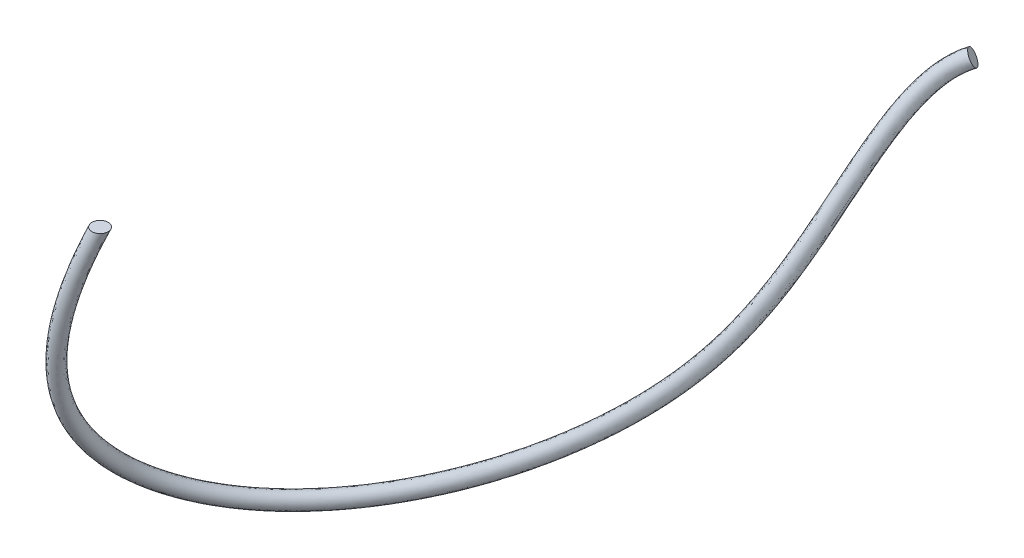
ISO-10303-21;
HEADER;
FILE_DESCRIPTION(('STEP AP214'),'2;1');
FILE_NAME('part.step','',(''),(''),'','','');
FILE_SCHEMA(('AUTOMOTIVE_DESIGN { 1 0 10303 214 1 1 1 1 }'));
ENDSEC;
DATA;
#1=APPLICATION_CONTEXT('core data for automotive mechanical design processes');
#2=APPLICATION_PROTOCOL_DEFINITION('international standard','automotive_design',2000,#1);
#3=PRODUCT_CONTEXT('',#1,'mechanical');
#4=PRODUCT('Part','Part','',(#3));
#5=PRODUCT_RELATED_PRODUCT_CATEGORY('part','',(#4));
#6=PRODUCT_DEFINITION_FORMATION('','',#4);
#7=PRODUCT_DEFINITION_CONTEXT('part definition',#1,'design');
#8=PRODUCT_DEFINITION('design','',#6,#7);
#9=PRODUCT_DEFINITION_SHAPE('','',#8);
#10=(LENGTH_UNIT() NAMED_UNIT(*) SI_UNIT(.MILLI.,.METRE.));
#11=(NAMED_UNIT(*) PLANE_ANGLE_UNIT() SI_UNIT($,.RADIAN.));
#12=(NAMED_UNIT(*) SI_UNIT($,.STERADIAN.) SOLID_ANGLE_UNIT());
#13=UNCERTAINTY_MEASURE_WITH_UNIT(LENGTH_MEASURE(1.E-05),#10,'distance_accuracy_value','');
#14=(GEOMETRIC_REPRESENTATION_CONTEXT(3) GLOBAL_UNCERTAINTY_ASSIGNED_CONTEXT((#13)) GLOBAL_UNIT_ASSIGNED_CONTEXT((#10,
#11,#12)) REPRESENTATION_CONTEXT('',''));
#15=CARTESIAN_POINT('',(0.,0.,0.));
#16=DIRECTION('',(0.,0.,1.));
#17=DIRECTION('',(1.,0.,0.));
#18=AXIS2_PLACEMENT_3D('',#15,#16,#17);
#19=CARTESIAN_POINT('',(0.,0.,0.));
#20=DIRECTION('',(0.,1.,0.));
#21=DIRECTION('',(0.,0.,1.));
#22=AXIS2_PLACEMENT_3D('',#19,#20,#21);
#23=PLANE('',#22);
#24=CARTESIAN_POINT('',(0.,0.,0.));
#25=DIRECTION('',(0.,1.,0.));
#26=DIRECTION('',(0.,0.,1.));
#27=AXIS2_PLACEMENT_3D('',#24,#25,#26);
#28=CIRCLE('',#27,7.5);
#29=CARTESIAN_POINT('',(0.,0.,7.5));
#30=VERTEX_POINT('',#29);
#31=EDGE_CURVE('E43',#30,#30,#28,.T.);
#32=ORIENTED_EDGE('',*,*,#31,.T.);
#33=EDGE_LOOP('',(#32));
#34=FACE_BOUND('',#33,.T.);
#35=ADVANCED_FACE('F40',(#34),#23,.T.);
#36=CARTESIAN_POINT('',(16.3575733903024,-250.728660027312,-788.848964241957));
#37=DIRECTION('',(-0.683695568227497,-0.446167800164738,0.57748996881525));
#38=DIRECTION('',(0.368721117797001,-0.894094457443813,-0.254243659623573));
#39=AXIS2_PLACEMENT_3D('',#36,#37,#38);
#40=PLANE('',#39);
#41=CARTESIAN_POINT('',(16.3575733903024,-250.728660027312,-788.848964241957));
#42=DIRECTION('',(-0.683695568227497,-0.446167800164738,0.57748996881525));
#43=DIRECTION('',(0.368721117797001,-0.894094457443813,-0.254243659623573));
#44=AXIS2_PLACEMENT_3D('',#41,#42,#43);
#45=CIRCLE('',#44,7.5);
#46=CARTESIAN_POINT('',(19.1229817737799,-257.43436845814,-790.755791689134));
#47=VERTEX_POINT('',#46);
#48=EDGE_CURVE('E10',#47,#47,#45,.T.);
#49=ORIENTED_EDGE('',*,*,#48,.F.);
#50=EDGE_LOOP('',(#49));
#51=FACE_BOUND('',#50,.T.);
#52=ADVANCED_FACE('F55',(#51),#40,.F.);
#53=CARTESIAN_POINT('',(0.,0.,7.5));
#54=CARTESIAN_POINT('',(-11.1618015849688,-32.0464705937914,16.0382003137222));
#55=CARTESIAN_POINT('',(-18.9478800948642,-60.5336568146009,20.0959737990293));
#56=CARTESIAN_POINT('',(-28.7630584166155,-111.260305422799,20.8725575819973));
#57=CARTESIAN_POINT('',(-30.7840470941697,-133.506888766767,17.5770635508047));
#58=CARTESIAN_POINT('',(-30.0401473990787,-172.30874768067,5.32295182935118));
#59=CARTESIAN_POINT('',(-27.2712051975191,-188.83273129367,-3.63054355530714));
#60=CARTESIAN_POINT('',(-18.2122338493691,-216.71564633669,-25.0994943581514));
#61=CARTESIAN_POINT('',(-11.9356352982529,-228.086848738524,-37.595818897333));
#62=CARTESIAN_POINT('',(-3.77736511397498,-238.396408369888,-52.3207695902847));
#63=CARTESIAN_POINT('',(-2.95915738033024,-239.358881332589,-53.7391039221649));
#64=CARTESIAN_POINT('',(-1.30242075018415,-241.239735220192,-56.5963553647243));
#65=CARTESIAN_POINT('',(-0.461518318297899,-242.157484029244,-58.0345049509065));
#66=CARTESIAN_POINT('',(2.09650771401458,-244.844227542704,-62.377240756336));
#67=CARTESIAN_POINT('',(3.84894917965659,-246.546714919568,-65.3101037685399));
#68=CARTESIAN_POINT('',(9.22957133003836,-251.400532502516,-74.2198135574643));
#69=CARTESIAN_POINT('',(12.9809682465942,-254.29823108983,-80.307684568391));
#70=CARTESIAN_POINT('',(24.5882343827688,-262.076320361142,-99.0034181225339));
#71=CARTESIAN_POINT('',(32.7965840400826,-266.042603698179,-112.043022664963));
#72=CARTESIAN_POINT('',(57.754126315555,-275.059825369128,-152.826632290379));
#73=CARTESIAN_POINT('',(74.8392986511099,-277.234937698086,-182.241158176726));
#74=CARTESIAN_POINT('',(104.241554883184,-277.814461691158,-245.201506912081));
#75=CARTESIAN_POINT('',(116.556841647994,-276.213552765347,-278.748784839952));
#76=CARTESIAN_POINT('',(127.185318850889,-273.825491693411,-331.826074783329));
#77=CARTESIAN_POINT('',(129.42076874177,-273.031412866059,-349.976469841928));
#78=CARTESIAN_POINT('',(130.576100882561,-271.916905031733,-387.12599135088));
#79=CARTESIAN_POINT('',(129.496097907829,-271.596508491265,-406.124625117153));
#80=CARTESIAN_POINT('',(122.623804864741,-271.927540678041,-449.363148233423));
#81=CARTESIAN_POINT('',(115.849064978897,-272.790158137765,-473.858944521846));
#82=CARTESIAN_POINT('',(99.0647375656334,-274.462809107408,-523.1251622497));
#83=CARTESIAN_POINT('',(89.0549722080328,-275.273202600413,-547.894089485221));
#84=CARTESIAN_POINT('',(68.8042929253061,-275.408584739741,-596.084480691814));
#85=CARTESIAN_POINT('',(58.5959772366743,-274.788941294156,-619.458398305459));
#86=CARTESIAN_POINT('',(39.9415068970359,-272.617424425601,-663.938580474761));
#87=CARTESIAN_POINT('',(31.4941364265422,-271.065307356145,-685.045894464));
#88=CARTESIAN_POINT('',(21.8030401643602,-268.368155355462,-713.917944906596));
#89=CARTESIAN_POINT('',(19.0697430825142,-267.407597624893,-723.076920350656));
#90=CARTESIAN_POINT('',(14.8819531175496,-265.419847094218,-740.27157195256));
#91=CARTESIAN_POINT('',(13.4277360549122,-264.392481637056,-748.30806614192));
#92=CARTESIAN_POINT('',(12.0879060547827,-262.331326948363,-763.040733837649));
#93=CARTESIAN_POINT('',(12.2052940273813,-261.297170307341,-769.73747903352));
#94=CARTESIAN_POINT('',(13.752168777139,-259.795459856179,-778.574843840509));
#95=CARTESIAN_POINT('',(14.4956838585473,-259.303331432565,-781.318572620361));
#96=CARTESIAN_POINT('',(16.4547186527017,-258.346255176376,-786.369208180903));
#97=CARTESIAN_POINT('',(17.6699131604589,-257.881449967253,-788.675467786732));
#98=CARTESIAN_POINT('',(19.1229817737799,-257.43436845814,-790.755791689134));
#99=CARTESIAN_POINT('',(15.,0.,7.5));
#100=CARTESIAN_POINT('',(3.83819841506113,-31.4719986749403,16.283221238473));
#101=CARTESIAN_POINT('',(-3.98348081546146,-59.2776055946513,20.6751286567963));
#102=CARTESIAN_POINT('',(-14.0774430845927,-108.505481033694,22.4818977301512));
#103=CARTESIAN_POINT('',(-16.3536869416441,-129.932909790625,19.9012060281644));
#104=CARTESIAN_POINT('',(-16.4223975532795,-167.411695931407,9.44436316614331));
#105=CARTESIAN_POINT('',(-14.2077073977538,-183.466422951943,1.55634067101938));
#106=CARTESIAN_POINT('',(-6.28292603161599,-211.036397708549,-17.9027063266077));
#107=CARTESIAN_POINT('',(-0.569937700859168,-222.53716187297,-29.4700778889347));
#108=CARTESIAN_POINT('',(7.0476825167024,-233.237930185374,-43.3085650515837));
#109=CARTESIAN_POINT('',(7.818050374449,-234.203750022783,-44.6681445619783));
#110=CARTESIAN_POINT('',(9.38101252929492,-236.102358306089,-47.4051910570711));
#111=CARTESIAN_POINT('',(10.1763781665679,-237.030514771748,-48.7849297164958));
#112=CARTESIAN_POINT('',(12.602082801414,-239.752601529689,-52.9576109198873));
#113=CARTESIAN_POINT('',(14.2720447687662,-241.484128712918,-55.7840285042406));
#114=CARTESIAN_POINT('',(19.423743961582,-246.437733261321,-64.3955216820766));
#115=CARTESIAN_POINT('',(23.0473873111753,-249.418670898604,-70.3128696414143));
#116=CARTESIAN_POINT('',(34.3487026401856,-257.470069596083,-88.5788022177583));
#117=CARTESIAN_POINT('',(42.4567771989537,-261.647627332644,-101.440596145388));
#118=CARTESIAN_POINT('',(67.3818813622576,-271.256374483098,-141.962632888555));
#119=CARTESIAN_POINT('',(84.7976596463846,-273.761591514803,-171.548600787601));
#120=CARTESIAN_POINT('',(115.272347809912,-274.711823203372,-235.492793673024));
#121=CARTESIAN_POINT('',(128.344934903229,-273.157475760103,-269.86806980089));
#122=CARTESIAN_POINT('',(140.101514385526,-270.676462534691,-324.840591944771));
#123=CARTESIAN_POINT('',(142.70786202187,-269.825696643224,-343.732468224646));
#124=CARTESIAN_POINT('',(144.498029827597,-268.575970784958,-382.562103387822));
#125=CARTESIAN_POINT('',(143.679849566361,-268.177565413607,-402.499739885691));
#126=CARTESIAN_POINT('',(137.175003762596,-268.354920456154,-447.940873668208));
#127=CARTESIAN_POINT('',(130.41523591804,-269.212059625179,-473.272659199804));
#128=CARTESIAN_POINT('',(113.64282033327,-270.926788808174,-523.669146198242));
#129=CARTESIAN_POINT('',(103.620278727544,-271.787096706797,-548.739269022935));
#130=CARTESIAN_POINT('',(83.3991192400739,-272.095990289879,-597.100573753718));
#131=CARTESIAN_POINT('',(73.2099789728912,-271.547657367645,-620.441190287453));
#132=CARTESIAN_POINT('',(54.6092884575632,-269.53190669043,-664.552268275368));
#133=CARTESIAN_POINT('',(46.2017089878359,-268.061793201332,-685.332890307513));
#134=CARTESIAN_POINT('',(36.5245462509587,-265.549963603695,-713.255304409086));
#135=CARTESIAN_POINT('',(33.7880984563526,-264.661910157035,-722.018599784729));
#136=CARTESIAN_POINT('',(29.5205693911793,-262.863745887792,-738.158260045614));
#137=CARTESIAN_POINT('',(27.9948527061985,-261.953047097885,-745.535428674984));
#138=CARTESIAN_POINT('',(26.2589411065192,-260.214619784816,-758.508564019051));
#139=CARTESIAN_POINT('',(26.0605709578844,-259.38845513115,-764.089634931135));
#140=CARTESIAN_POINT('',(26.5450853609075,-258.311180844175,-770.84401529819));
#141=CARTESIAN_POINT('',(26.8309943835309,-257.979395642789,-772.826950422941));
#142=CARTESIAN_POINT('',(27.5770164701473,-257.374535130084,-776.300911867307));
#143=CARTESIAN_POINT('',(28.0325593570667,-257.101835267341,-777.79190131357));
#144=CARTESIAN_POINT('',(28.5694704937878,-256.847756205887,-779.118793067141));
#145=CARTESIAN_POINT('',(15.,0.,-7.5));
#146=CARTESIAN_POINT('',(4.08321933982446,-30.5846587502039,1.28322123853289));
#147=CARTESIAN_POINT('',(-3.49677191498833,-57.2837248782407,5.75200948684173));
#148=CARTESIAN_POINT('',(-13.3090971208081,-103.83209669136,8.18221049955373));
#149=CARTESIAN_POINT('',(-15.5616141583675,-123.672320701203,6.17667856345405));
#150=CARTESIAN_POINT('',(-16.0264146178187,-158.111112702971,-2.4521639864545));
#151=CARTESIAN_POINT('',(-14.2396487865399,-172.775634245229,-9.09759054859961));
#152=CARTESIAN_POINT('',(-7.26868724001306,-198.360771738811,-26.0364025940292));
#153=CARTESIAN_POINT('',(-2.05473321200425,-209.242362172526,-36.3643968975322));
#154=CARTESIAN_POINT('',(5.21625817324012,-219.474459422272,-48.9856769131267));
#155=CARTESIAN_POINT('',(5.91280147394178,-220.408720088836,-50.2433893578483));
#156=CARTESIAN_POINT('',(7.3385569842177,-222.245706954372,-52.7752718244909));
#157=CARTESIAN_POINT('',(8.06579346334712,-223.145065404818,-54.0532485701849));
#158=CARTESIAN_POINT('',(10.2889087800855,-225.786485347814,-57.9233582513174));
#159=CARTESIAN_POINT('',(11.8262104868765,-227.471879789541,-60.5517009539324));
#160=CARTESIAN_POINT('',(16.5895434029187,-232.30727786717,-68.581359806034));
#161=CARTESIAN_POINT('',(19.967258284806,-235.236307670036,-74.1275316775799));
#162=CARTESIAN_POINT('',(30.5812174288102,-243.189742838208,-91.3340508362324));
#163=CARTESIAN_POINT('',(38.2994833869498,-247.377206564165,-103.56247932261));
#164=CARTESIAN_POINT('',(62.2704146565549,-257.099007207766,-142.366880019209));
#165=CARTESIAN_POINT('',(79.3301087299655,-259.779102595511,-171.039587977737));
#166=CARTESIAN_POINT('',(109.530348323645,-260.989187251536,-233.399492965097));
#167=CARTESIAN_POINT('',(122.688165322921,-259.53045560201,-267.100830973679));
#168=CARTESIAN_POINT('',(134.853330982799,-257.079146134796,-321.282834154365));
#169=CARTESIAN_POINT('',(137.642598269852,-256.219879220583,-339.950796340788));
#170=CARTESIAN_POINT('',(139.862965504266,-254.916207163591,-378.43860445991));
#171=CARTESIAN_POINT('',(139.291835468545,-254.47229168125,-398.259313371226));
#172=CARTESIAN_POINT('',(133.350371833246,-254.519520355862,-443.575055673749));
#173=CARTESIAN_POINT('',(126.824030311636,-255.343304901822,-468.820804175934));
#174=CARTESIAN_POINT('',(110.44840221485,-257.051599654611,-518.943371418106));
#175=CARTESIAN_POINT('',(100.589577434721,-257.938107785408,-543.828599932917));
#176=CARTESIAN_POINT('',(80.6623958767045,-258.378488954825,-591.675601469779));
#177=CARTESIAN_POINT('',(70.5618182333732,-257.89347614884,-614.82167335413));
#178=CARTESIAN_POINT('',(52.0129898036014,-255.999389768402,-658.622798678722));
#179=CARTESIAN_POINT('',(43.5711414335055,-254.588107763677,-679.285913845922));
#180=CARTESIAN_POINT('',(33.685809015693,-252.160281840829,-707.118163746837));
#181=CARTESIAN_POINT('',(30.853026742169,-251.299544357122,-715.866196300791));
#182=CARTESIAN_POINT('',(26.3119142367134,-249.5518634651,-732.033078183796));
#183=CARTESIAN_POINT('',(24.6083969485635,-248.664677405416,-739.451095193361));
#184=CARTESIAN_POINT('',(22.3986795364108,-246.95868451015,-752.639447714793));
#185=CARTESIAN_POINT('',(21.8983023571552,-246.142176362998,-758.393744041537));
#186=CARTESIAN_POINT('',(21.8592056625411,-245.042243942832,-765.644425555366));
#187=CARTESIAN_POINT('',(21.9599614940417,-244.696340264629,-767.833739548416));
#188=CARTESIAN_POINT('',(22.3497849957547,-244.043264504669,-771.822971375043));
#189=CARTESIAN_POINT('',(22.6349328984333,-243.736182624164,-773.624146680668));
#190=CARTESIAN_POINT('',(23.0386537268328,-243.43633934423,-775.305138172788));
#191=CARTESIAN_POINT('',(0.,0.,-7.5));
#192=CARTESIAN_POINT('',(-10.9167806602055,-31.159130669055,1.03820031378214));
#193=CARTESIAN_POINT('',(-18.4611711943802,-58.5397760981903,5.17285462908562));
#194=CARTESIAN_POINT('',(-27.9947124528418,-106.586921080465,6.57287035138895));
#195=CARTESIAN_POINT('',(-29.99197431091,-127.246299677209,3.85253608611124));
#196=CARTESIAN_POINT('',(-29.644164463601,-163.008164452369,-6.57357532326353));
#197=CARTESIAN_POINT('',(-27.3031465863277,-178.141942586956,-14.2844747749186));
#198=CARTESIAN_POINT('',(-19.1979950577436,-204.040020366952,-33.2331906255804));
#199=CARTESIAN_POINT('',(-13.4204308093979,-214.792049038081,-44.4901379059605));
#200=CARTESIAN_POINT('',(-5.60878945743726,-224.632937606786,-57.9978814518245));
#201=CARTESIAN_POINT('',(-4.86440628083786,-225.563851398642,-59.3143487180348));
#202=CARTESIAN_POINT('',(-3.34487629526097,-227.383083868475,-61.9664361321441));
#203=CARTESIAN_POINT('',(-2.57210302151784,-228.272034662326,-63.3028238045956));
#204=CARTESIAN_POINT('',(-0.216666307315527,-230.878111360803,-67.3429880877661));
#205=CARTESIAN_POINT('',(1.4031148977653,-232.534465996191,-70.0777762182382));
#206=CARTESIAN_POINT('',(6.39537077137831,-237.270077108365,-78.4056516814088));
#207=CARTESIAN_POINT('',(9.90083922021831,-240.115867861261,-84.1223466045566));
#208=CARTESIAN_POINT('',(20.8207491714066,-247.795993603268,-101.758666741008));
#209=CARTESIAN_POINT('',(28.6392902280925,-251.7721829297,-114.16490584224));
#210=CARTESIAN_POINT('',(52.6426596098247,-260.902458093796,-153.230879420922));
#211=CARTESIAN_POINT('',(69.3717477346907,-263.252448778795,-181.732145366862));
#212=CARTESIAN_POINT('',(98.4995553969169,-264.091825739322,-243.108206204154));
#213=CARTESIAN_POINT('',(110.900072067685,-262.586532607254,-275.981546012741));
#214=CARTESIAN_POINT('',(121.937135448162,-260.228175293517,-328.268316992924));
#215=CARTESIAN_POINT('',(124.355504989816,-259.425595443418,-346.19479795807));
#216=CARTESIAN_POINT('',(125.941036559166,-258.257141410366,-383.002492422969));
#217=CARTESIAN_POINT('',(125.108083810081,-257.891234758908,-401.884198602688));
#218=CARTESIAN_POINT('',(118.799172935307,-258.09214057775,-444.997330238964));
#219=CARTESIAN_POINT('',(112.257859372492,-258.921403414408,-469.407089497976));
#220=CARTESIAN_POINT('',(95.8703194472134,-260.587619953844,-518.399387469564));
#221=CARTESIAN_POINT('',(86.0242709152095,-261.424213679024,-542.983420395203));
#222=CARTESIAN_POINT('',(66.0675695619367,-261.691083404687,-590.659508407875));
#223=CARTESIAN_POINT('',(55.9478164971563,-261.134760075351,-613.838881372137));
#224=CARTESIAN_POINT('',(37.345208243074,-259.084907503573,-658.009110878116));
#225=CARTESIAN_POINT('',(28.8635688722206,-257.59162191849,-678.99891800241));
#226=CARTESIAN_POINT('',(18.9643029290901,-254.978473592596,-707.780804244348));
#227=CARTESIAN_POINT('',(16.1346713683306,-254.045231824981,-716.924516866717));
#228=CARTESIAN_POINT('',(11.6732979630836,-252.107964671526,-734.146390090742));
#229=CARTESIAN_POINT('',(10.0412802972805,-251.10411194464,-742.223732660298));
#230=CARTESIAN_POINT('',(8.22764448467106,-249.075391673645,-757.171617533391));
#231=CARTESIAN_POINT('',(8.04302542665488,-248.050891539232,-764.041588143922));
#232=CARTESIAN_POINT('',(9.06628907877123,-246.526522954814,-773.375254097685));
#233=CARTESIAN_POINT('',(9.62465096905812,-246.020276054366,-776.325361745836));
#234=CARTESIAN_POINT('',(11.2274871783091,-245.014984551001,-781.891267688638));
#235=CARTESIAN_POINT('',(12.2722867018349,-244.515797323946,-784.50771315383));
#236=CARTESIAN_POINT('',(13.5921650068249,-244.022951596483,-786.942136794781));
#237=CARTESIAN_POINT('',(-15.,0.,-7.5));
#238=CARTESIAN_POINT('',(-25.9167806602355,-31.733602587906,0.793179389031395));
#239=CARTESIAN_POINT('',(-33.4255704737721,-59.7958273181399,4.59369977132951));
#240=CARTESIAN_POINT('',(-42.6803277848756,-109.341745469569,4.96353020322417));
#241=CARTESIAN_POINT('',(-44.4223344634524,-130.820278653216,1.52839360876843));
#242=CARTESIAN_POINT('',(-43.2619143093832,-167.905216201767,-10.6949866600726));
#243=CARTESIAN_POINT('',(-40.3666443861156,-183.508250928683,-19.4713590012376));
#244=CARTESIAN_POINT('',(-31.127302875474,-209.719268995093,-40.4299786571316));
#245=CARTESIAN_POINT('',(-24.7861284067916,-220.341735903635,-52.6158789143888));
#246=CARTESIAN_POINT('',(-16.4338370881146,-229.7914157913,-67.0100859905224));
#247=CARTESIAN_POINT('',(-15.6416140356175,-230.718982708448,-68.3853080782214));
#248=CARTESIAN_POINT('',(-14.0283095747396,-232.520460782578,-71.1576004397973));
#249=CARTESIAN_POINT('',(-13.2099995063828,-233.399003919835,-72.5523990390063));
#250=CARTESIAN_POINT('',(-10.7222413947165,-235.969737373793,-76.7626179242148));
#251=CARTESIAN_POINT('',(-9.0199806913459,-237.597052202841,-79.603851482544));
#252=CARTESIAN_POINT('',(-3.79880186016213,-242.232876349559,-88.2299435567836));
#253=CARTESIAN_POINT('',(-0.165579844369368,-244.995428052487,-94.1171615315334));
#254=CARTESIAN_POINT('',(11.0602809140029,-252.402244368328,-112.183282645784));
#255=CARTESIAN_POINT('',(18.9790970692352,-256.167159295235,-124.76733236187));
#256=CARTESIAN_POINT('',(43.0149045630945,-264.705908979826,-164.094878822635));
#257=CARTESIAN_POINT('',(59.4133867394159,-266.725794962078,-192.424702755986));
#258=CARTESIAN_POINT('',(87.4687624701886,-267.194464227109,-252.816919443212));
#259=CARTESIAN_POINT('',(99.1119788124495,-265.642609612498,-284.862261051803));
#260=CARTESIAN_POINT('',(109.020939913525,-263.377204452237,-335.253799831482));
#261=CARTESIAN_POINT('',(111.068411709781,-262.631311666253,-352.438799575352));
#262=CARTESIAN_POINT('',(112.019107614066,-261.59807565714,-387.566380386028));
#263=CARTESIAN_POINT('',(110.924332151616,-261.310177836567,-405.509083834149));
#264=CARTESIAN_POINT('',(104.247974037368,-261.664760799637,-446.419604804179));
#265=CARTESIAN_POINT('',(97.6916884333491,-262.499501926993,-469.993374820018));
#266=CARTESIAN_POINT('',(81.2922366795773,-264.123640253078,-517.855403521023));
#267=CARTESIAN_POINT('',(71.4589643956981,-264.91031957264,-542.138240857489));
#268=CARTESIAN_POINT('',(51.4727432471689,-265.003677854548,-589.643415345971));
#269=CARTESIAN_POINT('',(41.3338147609393,-264.376044001861,-612.856089390144));
#270=CARTESIAN_POINT('',(22.6774266825466,-262.170425238744,-657.39542307751));
#271=CARTESIAN_POINT('',(14.1559963109357,-260.595136073302,-678.711922158898));
#272=CARTESIAN_POINT('',(4.24279684248713,-257.796665344363,-708.443444741858));
#273=CARTESIAN_POINT('',(1.4163159944922,-256.79091929284,-717.982837432644));
#274=CARTESIAN_POINT('',(-2.96531831054609,-254.664065877953,-736.259701997689));
#275=CARTESIAN_POINT('',(-4.52583635400256,-253.543546483864,-744.996370127235));
#276=CARTESIAN_POINT('',(-5.94339056706869,-251.192098837139,-761.703787351988));
#277=CARTESIAN_POINT('',(-5.81225150384546,-249.959606715466,-769.689432246307));
#278=CARTESIAN_POINT('',(-3.72662750499865,-248.010801966797,-781.106082640003));
#279=CARTESIAN_POINT('',(-2.71065955592542,-247.344211844103,-784.816983943255));
#280=CARTESIAN_POINT('',(0.105189360863562,-245.986704597333,-791.959564002234));
#281=CARTESIAN_POINT('',(1.90964050523643,-245.295412023727,-795.391279626992));
#282=CARTESIAN_POINT('',(4.14567628681689,-244.609563848736,-798.579135416774));
#283=CARTESIAN_POINT('',(-15.,0.,7.5));
#284=CARTESIAN_POINT('',(-26.1618015849988,-32.6209425126424,15.7931793889715));
#285=CARTESIAN_POINT('',(-33.912279374267,-61.7897080345505,19.5168189412623));
#286=CARTESIAN_POINT('',(-43.4486737486382,-114.015129811904,19.2632174338435));
#287=CARTESIAN_POINT('',(-45.2144072466953,-137.080867742908,15.2529210734449));
#288=CARTESIAN_POINT('',(-43.6578972448779,-177.205799429933,1.20154049255906));
#289=CARTESIAN_POINT('',(-40.3347029972843,-194.199039635397,-8.81742778163365));
#290=CARTESIAN_POINT('',(-30.1415416671221,-222.394894964831,-32.296282389695));
#291=CARTESIAN_POINT('',(-23.3013328956466,-233.636535604078,-45.7215599057314));
#292=CARTESIAN_POINT('',(-14.6024127446524,-243.554886554402,-61.3329741289857));
#293=CARTESIAN_POINT('',(-13.7363651351095,-244.514012642394,-62.8100632823515));
#294=CARTESIAN_POINT('',(-11.9858540296632,-246.377112134295,-65.7875196723775));
#295=CARTESIAN_POINT('',(-11.0994148031637,-247.28445328674,-67.2840801853173));
#296=CARTESIAN_POINT('',(-8.40906737338484,-249.93585355572,-71.7968705927847));
#297=CARTESIAN_POINT('',(-6.574146409453,-251.609301126217,-74.8361790328393));
#298=CARTESIAN_POINT('',(-0.964601301505294,-256.363331743711,-84.0441054328519));
#299=CARTESIAN_POINT('',(2.91454918201312,-259.177791281056,-90.3024994953678));
#300=CARTESIAN_POINT('',(14.827766125352,-266.682571126202,-109.428034027309));
#301=CARTESIAN_POINT('',(23.1363908812115,-270.437580063714,-122.645449184538));
#302=CARTESIAN_POINT('',(48.1263712688524,-278.863276255158,-163.690631692202));
#303=CARTESIAN_POINT('',(64.8809376558351,-280.70828388137,-192.93371556585));
#304=CARTESIAN_POINT('',(93.2107619564556,-280.917100178945,-254.910220151138));
#305=CARTESIAN_POINT('',(104.768748392758,-279.269629770591,-287.629499879014));
#306=CARTESIAN_POINT('',(114.269123316252,-276.974520852131,-338.811557621888));
#307=CARTESIAN_POINT('',(116.13367546167,-276.237129088894,-356.220471459209));
#308=CARTESIAN_POINT('',(116.654171937525,-275.257839278507,-391.689879313939));
#309=CARTESIAN_POINT('',(115.312346249296,-275.015451568924,-409.749510348614));
#310=CARTESIAN_POINT('',(108.072605966885,-275.500160899929,-450.785422798638));
#311=CARTESIAN_POINT('',(101.282894039754,-276.36825665035,-474.445229843889));
#312=CARTESIAN_POINT('',(84.4866547979973,-277.998829406641,-522.581178301159));
#313=CARTESIAN_POINT('',(74.4896656885214,-278.75930849403,-547.048909947506));
#314=CARTESIAN_POINT('',(54.2094666105383,-278.721179189602,-595.06838762991));
#315=CARTESIAN_POINT('',(43.9819755004573,-278.030225220666,-618.475606323466));
#316=CARTESIAN_POINT('',(25.2737253365085,-275.702942160771,-663.324892674156));
#317=CARTESIAN_POINT('',(16.7865638652485,-274.068821510957,-684.758898620488));
#318=CARTESIAN_POINT('',(7.08153407776162,-271.186347107229,-714.580585404107));
#319=CARTESIAN_POINT('',(4.3513877086758,-270.153285092752,-724.135240916582));
#320=CARTESIAN_POINT('',(0.243336843919827,-267.975948300645,-742.384883859506));
#321=CARTESIAN_POINT('',(-1.13938059637409,-266.831916176228,-751.080703608857));
#322=CARTESIAN_POINT('',(-2.08312899695382,-264.44803411191,-767.572903656246));
#323=CARTESIAN_POINT('',(-1.64998290312169,-263.205885483532,-775.385323135905));
#324=CARTESIAN_POINT('',(0.959252193370467,-261.279738868183,-786.305672382827));
#325=CARTESIAN_POINT('',(2.16037333356378,-260.627267222341,-789.810194817781));
#326=CARTESIAN_POINT('',(5.33242083525614,-259.317975222668,-796.437504494499));
#327=CARTESIAN_POINT('',(7.30726696385111,-258.661064667165,-799.559034259894));
#328=CARTESIAN_POINT('',(9.6764930537719,-258.020980710393,-802.392790311127));
#329=CARTESIAN_POINT('',(0.,0.,7.5));
#330=CARTESIAN_POINT('',(-11.1618015849688,-32.0464705937914,16.0382003137222));
#331=CARTESIAN_POINT('',(-18.9478800948642,-60.5336568146009,20.0959737990293));
#332=CARTESIAN_POINT('',(-28.7630584166155,-111.260305422799,20.8725575819973));
#333=CARTESIAN_POINT('',(-30.7840470941697,-133.506888766767,17.5770635508047));
#334=CARTESIAN_POINT('',(-30.0401473990787,-172.30874768067,5.32295182935118));
#335=CARTESIAN_POINT('',(-27.2712051975191,-188.83273129367,-3.63054355530714));
#336=CARTESIAN_POINT('',(-18.2122338493691,-216.71564633669,-25.0994943581514));
#337=CARTESIAN_POINT('',(-11.9356352982529,-228.086848738524,-37.595818897333));
#338=CARTESIAN_POINT('',(-3.77736511397498,-238.396408369888,-52.3207695902847));
#339=CARTESIAN_POINT('',(-2.95915738033024,-239.358881332589,-53.7391039221649));
#340=CARTESIAN_POINT('',(-1.30242075018415,-241.239735220192,-56.5963553647243));
#341=CARTESIAN_POINT('',(-0.461518318297899,-242.157484029244,-58.0345049509065));
#342=CARTESIAN_POINT('',(2.09650771401458,-244.844227542704,-62.377240756336));
#343=CARTESIAN_POINT('',(3.84894917965659,-246.546714919568,-65.3101037685399));
#344=CARTESIAN_POINT('',(9.22957133003836,-251.400532502516,-74.2198135574643));
#345=CARTESIAN_POINT('',(12.9809682465942,-254.29823108983,-80.307684568391));
#346=CARTESIAN_POINT('',(24.5882343827688,-262.076320361142,-99.0034181225339));
#347=CARTESIAN_POINT('',(32.7965840400826,-266.042603698179,-112.043022664963));
#348=CARTESIAN_POINT('',(57.754126315555,-275.059825369128,-152.826632290379));
#349=CARTESIAN_POINT('',(74.8392986511099,-277.234937698086,-182.241158176726));
#350=CARTESIAN_POINT('',(104.241554883184,-277.814461691158,-245.201506912081));
#351=CARTESIAN_POINT('',(116.556841647994,-276.213552765347,-278.748784839952));
#352=CARTESIAN_POINT('',(127.185318850889,-273.825491693411,-331.826074783329));
#353=CARTESIAN_POINT('',(129.42076874177,-273.031412866059,-349.976469841928));
#354=CARTESIAN_POINT('',(130.576100882561,-271.916905031733,-387.12599135088));
#355=CARTESIAN_POINT('',(129.496097907829,-271.596508491265,-406.124625117153));
#356=CARTESIAN_POINT('',(122.623804864741,-271.927540678041,-449.363148233423));
#357=CARTESIAN_POINT('',(115.849064978897,-272.790158137765,-473.858944521846));
#358=CARTESIAN_POINT('',(99.0647375656334,-274.462809107408,-523.1251622497));
#359=CARTESIAN_POINT('',(89.0549722080328,-275.273202600413,-547.894089485221));
#360=CARTESIAN_POINT('',(68.8042929253061,-275.408584739741,-596.084480691814));
#361=CARTESIAN_POINT('',(58.5959772366743,-274.788941294156,-619.458398305459));
#362=CARTESIAN_POINT('',(39.9415068970359,-272.617424425601,-663.938580474761));
#363=CARTESIAN_POINT('',(31.4941364265422,-271.065307356145,-685.045894464));
#364=CARTESIAN_POINT('',(21.8030401643602,-268.368155355462,-713.917944906596));
#365=CARTESIAN_POINT('',(19.0697430825142,-267.407597624893,-723.076920350656));
#366=CARTESIAN_POINT('',(14.8819531175496,-265.419847094218,-740.27157195256));
#367=CARTESIAN_POINT('',(13.4277360549122,-264.392481637056,-748.30806614192));
#368=CARTESIAN_POINT('',(12.0879060547827,-262.331326948363,-763.040733837649));
#369=CARTESIAN_POINT('',(12.2052940273813,-261.297170307341,-769.73747903352));
#370=CARTESIAN_POINT('',(13.752168777139,-259.795459856179,-778.574843840509));
#371=CARTESIAN_POINT('',(14.4956838585473,-259.303331432565,-781.318572620361));
#372=CARTESIAN_POINT('',(16.4547186527017,-258.346255176376,-786.369208180903));
#373=CARTESIAN_POINT('',(17.6699131604589,-257.881449967253,-788.675467786732));
#374=CARTESIAN_POINT('',(19.1229817737799,-257.43436845814,-790.755791689134));
#375=(BOUNDED_SURFACE() B_SPLINE_SURFACE(3,3,((#53,#54,#55,#56,#57,#58,#59,#60,#61,#62,#63,#64,
#65,#66,#67,#68,#69,#70,#71,#72,#73,#74,#75,#76,#77,#78,#79,#80,#81,#82,#83,#84,#85,#86,#87,#88,
#89,#90,#91,#92,#93,#94,#95,#96,#97,#98),(#99,#100,#101,#102,#103,#104,#105,#106,#107,#108,#109,
#110,#111,#112,#113,#114,#115,#116,#117,#118,#119,#120,#121,#122,#123,#124,#125,#126,#127,#128,
#129,#130,#131,#132,#133,#134,#135,#136,#137,#138,#139,#140,#141,#142,#143,#144),(#145,#146,
#147,#148,#149,#150,#151,#152,#153,#154,#155,#156,#157,#158,#159,#160,#161,#162,#163,#164,#165,
#166,#167,#168,#169,#170,#171,#172,#173,#174,#175,#176,#177,#178,#179,#180,#181,#182,#183,#184,
#185,#186,#187,#188,#189,#190),(#191,#192,#193,#194,#195,#196,#197,#198,#199,#200,#201,#202,
#203,#204,#205,#206,#207,#208,#209,#210,#211,#212,#213,#214,#215,#216,#217,#218,#219,#220,#221,
#222,#223,#224,#225,#226,#227,#228,#229,#230,#231,#232,#233,#234,#235,#236),(#237,#238,#239,
#240,#241,#242,#243,#244,#245,#246,#247,#248,#249,#250,#251,#252,#253,#254,#255,#256,#257,#258,
#259,#260,#261,#262,#263,#264,#265,#266,#267,#268,#269,#270,#271,#272,#273,#274,#275,#276,#277,
#278,#279,#280,#281,#282),(#283,#284,#285,#286,#287,#288,#289,#290,#291,#292,#293,#294,#295,
#296,#297,#298,#299,#300,#301,#302,#303,#304,#305,#306,#307,#308,#309,#310,#311,#312,#313,#314,
#315,#316,#317,#318,#319,#320,#321,#322,#323,#324,#325,#326,#327,#328),(#329,#330,#331,#332,
#333,#334,#335,#336,#337,#338,#339,#340,#341,#342,#343,#344,#345,#346,#347,#348,#349,#350,#351,
#352,#353,#354,#355,#356,#357,#358,#359,#360,#361,#362,#363,#364,#365,#366,#367,#368,#369,#370,
#371,#372,#373,#374)),.UNSPECIFIED.,.T.,.F.,.F.) B_SPLINE_SURFACE_WITH_KNOTS((4,3,4),(4,2,2,2,2,
2,2,2,2,2,2,2,2,2,2,2,2,2,2,2,2,2,4),(0.,0.5,1.),(0.,0.058866594804339,0.117733189608678,
0.176599784413017,0.235466379217356,0.241729157008712,0.247991934800068,0.260517490382779,
0.285568601548203,0.33567082387905,0.435875268540744,0.536079713202438,0.586181935533285,
0.636284157864132,0.697893832893899,0.759503507923666,0.81962763094275,0.879751753961833,
0.909813815471375,0.939875876980917,0.969937938490458,0.984968969245229,1.),
.UNSPECIFIED.) GEOMETRIC_REPRESENTATION_ITEM() RATIONAL_B_SPLINE_SURFACE(((1.,1.,1.,1.,1.,1.,1.,
1.,1.,1.,1.,1.,1.,1.,1.,1.,1.,1.,1.,1.,1.,1.,1.,1.,1.,1.,1.,1.,1.,1.,1.,1.,1.,1.,1.,1.,1.,1.,1.,
1.,1.,1.,1.,1.,1.,1.),(0.333333333333333,0.333333333333333,0.333333333333333,0.333333333333333,
0.333333333333333,0.333333333333333,0.333333333333333,0.333333333333333,0.333333333333333,
0.333333333333333,0.333333333333333,0.333333333333333,0.333333333333333,0.333333333333333,
0.333333333333333,0.333333333333333,0.333333333333333,0.333333333333333,0.333333333333333,
0.333333333333333,0.333333333333333,0.333333333333333,0.333333333333333,0.333333333333333,
0.333333333333333,0.333333333333333,0.333333333333333,0.333333333333333,0.333333333333333,
0.333333333333333,0.333333333333333,0.333333333333333,0.333333333333333,0.333333333333333,
0.333333333333333,0.333333333333333,0.333333333333333,0.333333333333333,0.333333333333333,
0.333333333333333,0.333333333333333,0.333333333333333,0.333333333333333,0.333333333333333,
0.333333333333333,0.333333333333333),(0.333333333333333,0.333333333333333,0.333333333333333,
0.333333333333333,0.333333333333333,0.333333333333333,0.333333333333333,0.333333333333333,
0.333333333333333,0.333333333333333,0.333333333333333,0.333333333333333,0.333333333333333,
0.333333333333333,0.333333333333333,0.333333333333333,0.333333333333333,0.333333333333333,
0.333333333333333,0.333333333333333,0.333333333333333,0.333333333333333,0.333333333333333,
0.333333333333333,0.333333333333333,0.333333333333333,0.333333333333333,0.333333333333333,
0.333333333333333,0.333333333333333,0.333333333333333,0.333333333333333,0.333333333333333,
0.333333333333333,0.333333333333333,0.333333333333333,0.333333333333333,0.333333333333333,
0.333333333333333,0.333333333333333,0.333333333333333,0.333333333333333,0.333333333333333,
0.333333333333333,0.333333333333333,0.333333333333333),(1.,1.,1.,1.,1.,1.,1.,1.,1.,1.,1.,1.,1.,
1.,1.,1.,1.,1.,1.,1.,1.,1.,1.,1.,1.,1.,1.,1.,1.,1.,1.,1.,1.,1.,1.,1.,1.,1.,1.,1.,1.,1.,1.,1.,1.,
1.),(0.333333333333333,0.333333333333333,0.333333333333333,0.333333333333333,0.333333333333333,
0.333333333333333,0.333333333333333,0.333333333333333,0.333333333333333,0.333333333333333,
0.333333333333333,0.333333333333333,0.333333333333333,0.333333333333333,0.333333333333333,
0.333333333333333,0.333333333333333,0.333333333333333,0.333333333333333,0.333333333333333,
0.333333333333333,0.333333333333333,0.333333333333333,0.333333333333333,0.333333333333333,
0.333333333333333,0.333333333333333,0.333333333333333,0.333333333333333,0.333333333333333,
0.333333333333333,0.333333333333333,0.333333333333333,0.333333333333333,0.333333333333333,
0.333333333333333,0.333333333333333,0.333333333333333,0.333333333333333,0.333333333333333,
0.333333333333333,0.333333333333333,0.333333333333333,0.333333333333333,0.333333333333333,
0.333333333333333),(0.333333333333333,0.333333333333333,0.333333333333333,0.333333333333333,
0.333333333333333,0.333333333333333,0.333333333333333,0.333333333333333,0.333333333333333,
0.333333333333333,0.333333333333333,0.333333333333333,0.333333333333333,0.333333333333333,
0.333333333333333,0.333333333333333,0.333333333333333,0.333333333333333,0.333333333333333,
0.333333333333333,0.333333333333333,0.333333333333333,0.333333333333333,0.333333333333333,
0.333333333333333,0.333333333333333,0.333333333333333,0.333333333333333,0.333333333333333,
0.333333333333333,0.333333333333333,0.333333333333333,0.333333333333333,0.333333333333333,
0.333333333333333,0.333333333333333,0.333333333333333,0.333333333333333,0.333333333333333,
0.333333333333333,0.333333333333333,0.333333333333333,0.333333333333333,0.333333333333333,
0.333333333333333,0.333333333333333),(1.,1.,1.,1.,1.,1.,1.,1.,1.,1.,1.,1.,1.,1.,1.,1.,1.,1.,1.,
1.,1.,1.,1.,1.,1.,1.,1.,1.,1.,1.,1.,1.,1.,1.,1.,1.,1.,1.,1.,1.,1.,1.,1.,1.,1.,1.))) REPRESENTATION_ITEM('') SURFACE());
#376=ORIENTED_EDGE('',*,*,#48,.T.);
#377=EDGE_LOOP('',(#376));
#378=FACE_BOUND('',#377,.T.);
#379=ORIENTED_EDGE('',*,*,#31,.F.);
#380=EDGE_LOOP('',(#379));
#381=FACE_BOUND('',#380,.T.);
#382=ADVANCED_FACE('F49',(#378,#381),#375,.F.);
#383=CLOSED_SHELL('',(#35,#52,#382));
#384=MANIFOLD_SOLID_BREP('B2',#383);
#385=ADVANCED_BREP_SHAPE_REPRESENTATION('',(#18,#384),#14);
#386=SHAPE_DEFINITION_REPRESENTATION(#9,#385);
ENDSEC;
END-ISO-10303-21;
